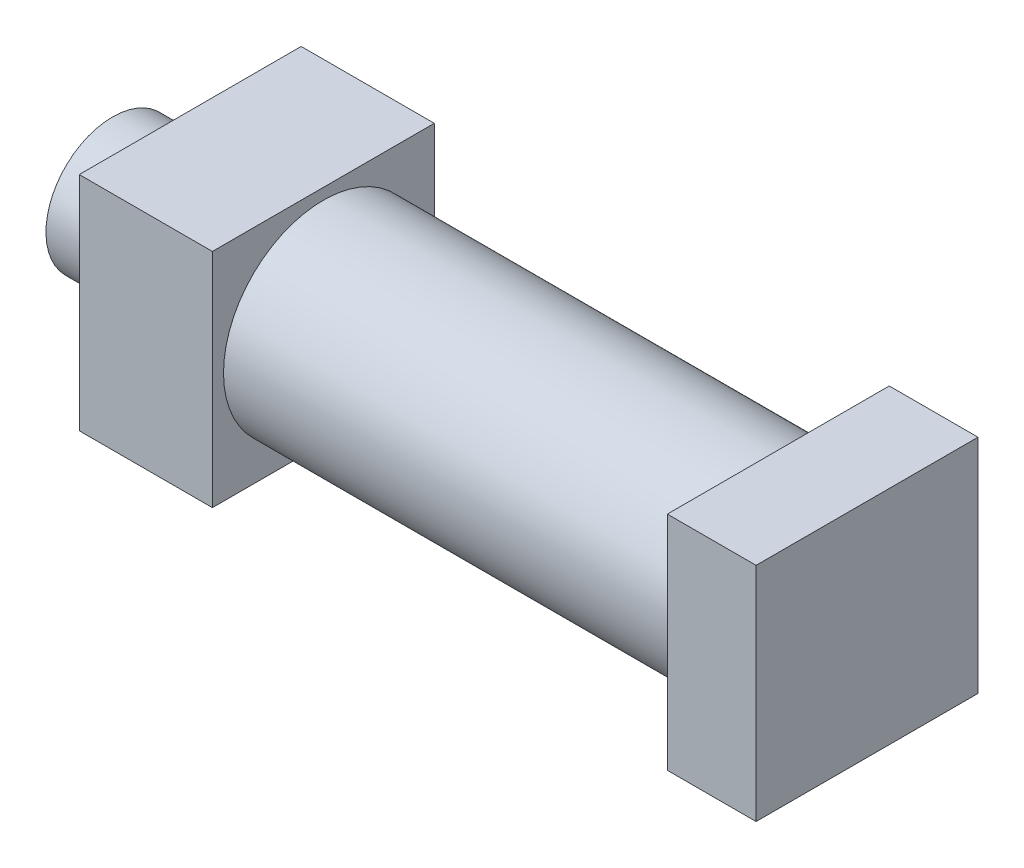
ISO-10303-21;
HEADER;
FILE_DESCRIPTION(('STEP AP214'),'2;1');
FILE_NAME('part.step','',(''),(''),'','','');
FILE_SCHEMA(('AUTOMOTIVE_DESIGN { 1 0 10303 214 1 1 1 1 }'));
ENDSEC;
DATA;
#1=APPLICATION_CONTEXT('core data for automotive mechanical design processes');
#2=APPLICATION_PROTOCOL_DEFINITION('international standard','automotive_design',2000,#1);
#3=PRODUCT_CONTEXT('',#1,'mechanical');
#4=PRODUCT('Part','Part','',(#3));
#5=PRODUCT_RELATED_PRODUCT_CATEGORY('part','',(#4));
#6=PRODUCT_DEFINITION_FORMATION('','',#4);
#7=PRODUCT_DEFINITION_CONTEXT('part definition',#1,'design');
#8=PRODUCT_DEFINITION('design','',#6,#7);
#9=PRODUCT_DEFINITION_SHAPE('','',#8);
#10=(LENGTH_UNIT() NAMED_UNIT(*) SI_UNIT(.MILLI.,.METRE.));
#11=(NAMED_UNIT(*) PLANE_ANGLE_UNIT() SI_UNIT($,.RADIAN.));
#12=(NAMED_UNIT(*) SI_UNIT($,.STERADIAN.) SOLID_ANGLE_UNIT());
#13=UNCERTAINTY_MEASURE_WITH_UNIT(LENGTH_MEASURE(1.E-05),#10,'distance_accuracy_value','');
#14=(GEOMETRIC_REPRESENTATION_CONTEXT(3) GLOBAL_UNCERTAINTY_ASSIGNED_CONTEXT((#13)) GLOBAL_UNIT_ASSIGNED_CONTEXT((#10,
#11,#12)) REPRESENTATION_CONTEXT('',''));
#15=CARTESIAN_POINT('',(0.,0.,0.));
#16=DIRECTION('',(0.,0.,1.));
#17=DIRECTION('',(1.,0.,0.));
#18=AXIS2_PLACEMENT_3D('',#15,#16,#17);
#19=CARTESIAN_POINT('',(-155.575,-31.75,-31.75));
#20=DIRECTION('',(0.,-1.,0.));
#21=DIRECTION('',(1.,0.,0.));
#22=AXIS2_PLACEMENT_3D('',#19,#20,#21);
#23=PLANE('',#22);
#24=DIRECTION('',(0.,0.,1.));
#25=VECTOR('',#24,1.);
#26=CARTESIAN_POINT('',(-193.675,-31.75,-31.75));
#27=LINE('',#26,#25);
#28=CARTESIAN_POINT('',(-193.675,-31.75,-31.75));
#29=VERTEX_POINT('',#28);
#30=CARTESIAN_POINT('',(-193.675,-31.75,31.75));
#31=VERTEX_POINT('',#30);
#32=EDGE_CURVE('E148',#29,#31,#27,.T.);
#33=ORIENTED_EDGE('',*,*,#32,.F.);
#34=DIRECTION('',(-1.,0.,0.));
#35=VECTOR('',#34,1.);
#36=CARTESIAN_POINT('',(-155.575,-31.75,-31.75));
#37=LINE('',#36,#35);
#38=CARTESIAN_POINT('',(-155.575,-31.75,-31.75));
#39=VERTEX_POINT('',#38);
#40=EDGE_CURVE('E136',#39,#29,#37,.T.);
#41=ORIENTED_EDGE('',*,*,#40,.F.);
#42=DIRECTION('',(0.,0.,1.));
#43=VECTOR('',#42,1.);
#44=CARTESIAN_POINT('',(-155.575,-31.75,-31.75));
#45=LINE('',#44,#43);
#46=CARTESIAN_POINT('',(-155.575,-31.75,31.75));
#47=VERTEX_POINT('',#46);
#48=EDGE_CURVE('E130',#39,#47,#45,.T.);
#49=ORIENTED_EDGE('',*,*,#48,.T.);
#50=DIRECTION('',(-1.,0.,0.));
#51=VECTOR('',#50,1.);
#52=CARTESIAN_POINT('',(-155.575,-31.75,31.75));
#53=LINE('',#52,#51);
#54=EDGE_CURVE('E111',#47,#31,#53,.T.);
#55=ORIENTED_EDGE('',*,*,#54,.T.);
#56=EDGE_LOOP('',(#33,#41,#49,#55));
#57=FACE_BOUND('',#56,.T.);
#58=CARTESIAN_POINT('',(-174.625,-31.7499999998176,-11.1125));
#59=DIRECTION('',(0.,-1.,0.));
#60=DIRECTION('',(0.,0.,-1.));
#61=AXIS2_PLACEMENT_3D('',#58,#59,#60);
#62=CIRCLE('',#61,3.96874999999999);
#63=CARTESIAN_POINT('',(-174.625,-31.7499999998176,-15.08125));
#64=VERTEX_POINT('',#63);
#65=EDGE_CURVE('E483',#64,#64,#62,.T.);
#66=ORIENTED_EDGE('',*,*,#65,.F.);
#67=EDGE_LOOP('',(#66));
#68=FACE_BOUND('',#67,.T.);
#69=CARTESIAN_POINT('',(-174.625,-31.7499999998176,11.1125));
#70=DIRECTION('',(0.,1.,0.));
#71=DIRECTION('',(0.,0.,1.));
#72=AXIS2_PLACEMENT_3D('',#69,#70,#71);
#73=CIRCLE('',#72,3.96874999999999);
#74=CARTESIAN_POINT('',(-174.625,-31.7499999998176,7.14375000000002));
#75=VERTEX_POINT('',#74);
#76=EDGE_CURVE('E489',#75,#75,#73,.T.);
#77=ORIENTED_EDGE('',*,*,#76,.T.);
#78=EDGE_LOOP('',(#77));
#79=FACE_BOUND('',#78,.T.);
#80=ADVANCED_FACE('F34',(#57,#68,#79),#23,.T.);
#81=CARTESIAN_POINT('',(-25.4,-31.75,-31.75));
#82=DIRECTION('',(0.,1.,0.));
#83=DIRECTION('',(0.,0.,1.));
#84=AXIS2_PLACEMENT_3D('',#81,#82,#83);
#85=PLANE('',#84);
#86=DIRECTION('',(0.,0.,1.));
#87=VECTOR('',#86,1.);
#88=CARTESIAN_POINT('',(0.,-31.75,-31.75));
#89=LINE('',#88,#87);
#90=CARTESIAN_POINT('',(0.,-31.75,-31.75));
#91=VERTEX_POINT('',#90);
#92=CARTESIAN_POINT('',(0.,-31.75,31.75));
#93=VERTEX_POINT('',#92);
#94=EDGE_CURVE('E178',#91,#93,#89,.T.);
#95=ORIENTED_EDGE('',*,*,#94,.T.);
#96=DIRECTION('',(1.,0.,0.));
#97=VECTOR('',#96,1.);
#98=CARTESIAN_POINT('',(-25.4,-31.75,31.75));
#99=LINE('',#98,#97);
#100=CARTESIAN_POINT('',(-25.4,-31.75,31.75));
#101=VERTEX_POINT('',#100);
#102=EDGE_CURVE('E175',#101,#93,#99,.T.);
#103=ORIENTED_EDGE('',*,*,#102,.F.);
#104=DIRECTION('',(0.,0.,1.));
#105=VECTOR('',#104,1.);
#106=CARTESIAN_POINT('',(-25.4,-31.75,-31.75));
#107=LINE('',#106,#105);
#108=CARTESIAN_POINT('',(-25.4,-31.75,-31.75));
#109=VERTEX_POINT('',#108);
#110=EDGE_CURVE('E82',#109,#101,#107,.T.);
#111=ORIENTED_EDGE('',*,*,#110,.F.);
#112=DIRECTION('',(1.,0.,0.));
#113=VECTOR('',#112,1.);
#114=CARTESIAN_POINT('',(-25.4,-31.75,-31.75));
#115=LINE('',#114,#113);
#116=EDGE_CURVE('E187',#109,#91,#115,.T.);
#117=ORIENTED_EDGE('',*,*,#116,.T.);
#118=EDGE_LOOP('',(#95,#103,#111,#117));
#119=FACE_BOUND('',#118,.T.);
#120=CARTESIAN_POINT('',(-12.7,-31.7499999998176,-11.1125));
#121=DIRECTION('',(0.,-1.,0.));
#122=DIRECTION('',(0.,0.,-1.));
#123=AXIS2_PLACEMENT_3D('',#120,#121,#122);
#124=CIRCLE('',#123,3.96874999999999);
#125=CARTESIAN_POINT('',(-12.7,-31.7499999998176,-15.08125));
#126=VERTEX_POINT('',#125);
#127=EDGE_CURVE('E471',#126,#126,#124,.T.);
#128=ORIENTED_EDGE('',*,*,#127,.F.);
#129=EDGE_LOOP('',(#128));
#130=FACE_BOUND('',#129,.T.);
#131=CARTESIAN_POINT('',(-12.7,-31.7499999998176,11.1125));
#132=DIRECTION('',(0.,1.,0.));
#133=DIRECTION('',(0.,0.,1.));
#134=AXIS2_PLACEMENT_3D('',#131,#132,#133);
#135=CIRCLE('',#134,3.96874999999999);
#136=CARTESIAN_POINT('',(-12.7,-31.7499999998176,7.14375));
#137=VERTEX_POINT('',#136);
#138=EDGE_CURVE('E477',#137,#137,#135,.T.);
#139=ORIENTED_EDGE('',*,*,#138,.T.);
#140=EDGE_LOOP('',(#139));
#141=FACE_BOUND('',#140,.T.);
#142=ADVANCED_FACE('F217',(#119,#130,#141),#85,.F.);
#143=CARTESIAN_POINT('',(-25.4,-31.75,31.75));
#144=DIRECTION('',(-1.,0.,0.));
#145=DIRECTION('',(0.,0.,1.));
#146=AXIS2_PLACEMENT_3D('',#143,#144,#145);
#147=PLANE('',#146);
#148=CARTESIAN_POINT('',(-25.4,0.,0.));
#149=DIRECTION('',(-1.,0.,0.));
#150=DIRECTION('',(0.,0.,1.));
#151=AXIS2_PLACEMENT_3D('',#148,#149,#150);
#152=CIRCLE('',#151,25.4);
#153=CARTESIAN_POINT('',(-25.4,0.,25.4));
#154=VERTEX_POINT('',#153);
#155=EDGE_CURVE('E160',#154,#154,#152,.F.);
#156=ORIENTED_EDGE('',*,*,#155,.F.);
#157=EDGE_LOOP('',(#156));
#158=FACE_BOUND('',#157,.T.);
#159=ADVANCED_FACE('F207',(#158),#147,.T.);
#160=CARTESIAN_POINT('',(-274.497305089622,0.,0.));
#161=DIRECTION('',(1.,0.,0.));
#162=DIRECTION('',(0.,0.,-1.));
#163=AXIS2_PLACEMENT_3D('',#160,#161,#162);
#164=CYLINDRICAL_SURFACE('',#163,25.4);
#165=ORIENTED_EDGE('',*,*,#155,.T.);
#166=EDGE_LOOP('',(#165));
#167=FACE_BOUND('',#166,.T.);
#168=CARTESIAN_POINT('',(-155.575,0.,0.));
#169=DIRECTION('',(-1.,0.,0.));
#170=DIRECTION('',(0.,0.,1.));
#171=AXIS2_PLACEMENT_3D('',#168,#169,#170);
#172=CIRCLE('',#171,25.4);
#173=CARTESIAN_POINT('',(-155.575,0.,25.4));
#174=VERTEX_POINT('',#173);
#175=EDGE_CURVE('E154',#174,#174,#172,.T.);
#176=ORIENTED_EDGE('',*,*,#175,.T.);
#177=EDGE_LOOP('',(#176));
#178=FACE_BOUND('',#177,.T.);
#179=ADVANCED_FACE('F193',(#167,#178),#164,.F.);
#180=CARTESIAN_POINT('',(-155.575,-31.75,31.75));
#181=DIRECTION('',(-1.,0.,0.));
#182=DIRECTION('',(0.,0.,1.));
#183=AXIS2_PLACEMENT_3D('',#180,#181,#182);
#184=PLANE('',#183);
#185=CARTESIAN_POINT('',(-155.575,0.,0.));
#186=DIRECTION('',(-1.,0.,0.));
#187=DIRECTION('',(0.,0.,1.));
#188=AXIS2_PLACEMENT_3D('',#185,#186,#187);
#189=CIRCLE('',#188,12.7);
#190=CARTESIAN_POINT('',(-155.575,0.,12.7));
#191=VERTEX_POINT('',#190);
#192=EDGE_CURVE('E38',#191,#191,#189,.T.);
#193=ORIENTED_EDGE('',*,*,#192,.T.);
#194=EDGE_LOOP('',(#193));
#195=FACE_BOUND('',#194,.T.);
#196=ORIENTED_EDGE('',*,*,#175,.F.);
#197=EDGE_LOOP('',(#196));
#198=FACE_BOUND('',#197,.T.);
#199=ADVANCED_FACE('F195',(#195,#198),#184,.F.);
#200=CARTESIAN_POINT('',(10.5210244842766,0.,0.));
#201=DIRECTION('',(-1.,0.,0.));
#202=DIRECTION('',(0.,-1.,0.));
#203=AXIS2_PLACEMENT_3D('',#200,#201,#202);
#204=CYLINDRICAL_SURFACE('',#203,12.7);
#205=CARTESIAN_POINT('',(-215.9,0.,0.));
#206=DIRECTION('',(-1.,0.,0.));
#207=DIRECTION('',(0.,-1.,0.));
#208=AXIS2_PLACEMENT_3D('',#205,#206,#207);
#209=CIRCLE('',#208,12.7);
#210=CARTESIAN_POINT('',(-215.9,-12.7,0.));
#211=VERTEX_POINT('',#210);
#212=EDGE_CURVE('E465',#211,#211,#209,.T.);
#213=ORIENTED_EDGE('',*,*,#212,.T.);
#214=EDGE_LOOP('',(#213));
#215=FACE_BOUND('',#214,.T.);
#216=ORIENTED_EDGE('',*,*,#192,.F.);
#217=EDGE_LOOP('',(#216));
#218=FACE_BOUND('',#217,.T.);
#219=ADVANCED_FACE('F197',(#215,#218),#204,.F.);
#220=CARTESIAN_POINT('',(-274.497305089622,0.,0.));
#221=DIRECTION('',(1.,0.,0.));
#222=DIRECTION('',(0.,0.,-1.));
#223=AXIS2_PLACEMENT_3D('',#220,#221,#222);
#224=CYLINDRICAL_SURFACE('',#223,28.575);
#225=CARTESIAN_POINT('',(-25.4,0.,0.));
#226=DIRECTION('',(-1.,0.,0.));
#227=DIRECTION('',(0.,0.,1.));
#228=AXIS2_PLACEMENT_3D('',#225,#226,#227);
#229=CIRCLE('',#228,28.575);
#230=CARTESIAN_POINT('',(-25.4,0.,28.575));
#231=VERTEX_POINT('',#230);
#232=EDGE_CURVE('E163',#231,#231,#229,.F.);
#233=ORIENTED_EDGE('',*,*,#232,.F.);
#234=EDGE_LOOP('',(#233));
#235=FACE_BOUND('',#234,.T.);
#236=CARTESIAN_POINT('',(-155.575,0.,0.));
#237=DIRECTION('',(-1.,0.,0.));
#238=DIRECTION('',(0.,0.,1.));
#239=AXIS2_PLACEMENT_3D('',#236,#237,#238);
#240=CIRCLE('',#239,28.575);
#241=CARTESIAN_POINT('',(-155.575,0.,28.575));
#242=VERTEX_POINT('',#241);
#243=EDGE_CURVE('E44',#242,#242,#240,.T.);
#244=ORIENTED_EDGE('',*,*,#243,.F.);
#245=EDGE_LOOP('',(#244));
#246=FACE_BOUND('',#245,.T.);
#247=ADVANCED_FACE('F204',(#235,#246),#224,.T.);
#248=DIRECTION('',(0.,-1.,0.));
#249=VECTOR('',#248,1.);
#250=CARTESIAN_POINT('',(-25.4,31.75,31.75));
#251=LINE('',#250,#249);
#252=CARTESIAN_POINT('',(-25.4,31.75,31.75));
#253=VERTEX_POINT('',#252);
#254=EDGE_CURVE('E167',#253,#101,#251,.T.);
#255=ORIENTED_EDGE('',*,*,#254,.F.);
#256=DIRECTION('',(0.,0.,-1.));
#257=VECTOR('',#256,1.);
#258=CARTESIAN_POINT('',(-25.4,31.75,31.75));
#259=LINE('',#258,#257);
#260=CARTESIAN_POINT('',(-25.4,31.75,-31.75));
#261=VERTEX_POINT('',#260);
#262=EDGE_CURVE('E173',#253,#261,#259,.T.);
#263=ORIENTED_EDGE('',*,*,#262,.T.);
#264=DIRECTION('',(0.,1.,0.));
#265=VECTOR('',#264,1.);
#266=CARTESIAN_POINT('',(-25.4,-31.75,-31.75));
#267=LINE('',#266,#265);
#268=EDGE_CURVE('E171',#109,#261,#267,.T.);
#269=ORIENTED_EDGE('',*,*,#268,.F.);
#270=ORIENTED_EDGE('',*,*,#110,.T.);
#271=EDGE_LOOP('',(#255,#263,#269,#270));
#272=FACE_BOUND('',#271,.T.);
#273=ORIENTED_EDGE('',*,*,#232,.T.);
#274=EDGE_LOOP('',(#273));
#275=FACE_BOUND('',#274,.T.);
#276=ADVANCED_FACE('F228',(#272,#275),#147,.T.);
#277=CARTESIAN_POINT('',(-25.4,31.75,31.75));
#278=DIRECTION('',(0.,0.,1.));
#279=DIRECTION('',(0.,-1.,0.));
#280=AXIS2_PLACEMENT_3D('',#277,#278,#279);
#281=PLANE('',#280);
#282=DIRECTION('',(0.,-1.,0.));
#283=VECTOR('',#282,1.);
#284=CARTESIAN_POINT('',(0.,31.75,31.75));
#285=LINE('',#284,#283);
#286=CARTESIAN_POINT('',(0.,31.75,31.75));
#287=VERTEX_POINT('',#286);
#288=EDGE_CURVE('E166',#287,#93,#285,.T.);
#289=ORIENTED_EDGE('',*,*,#288,.F.);
#290=DIRECTION('',(1.,0.,0.));
#291=VECTOR('',#290,1.);
#292=CARTESIAN_POINT('',(-25.4,31.75,31.75));
#293=LINE('',#292,#291);
#294=EDGE_CURVE('E52',#253,#287,#293,.T.);
#295=ORIENTED_EDGE('',*,*,#294,.F.);
#296=ORIENTED_EDGE('',*,*,#254,.T.);
#297=ORIENTED_EDGE('',*,*,#102,.T.);
#298=EDGE_LOOP('',(#289,#295,#296,#297));
#299=FACE_BOUND('',#298,.T.);
#300=ADVANCED_FACE('F36',(#299),#281,.T.);
#301=CARTESIAN_POINT('',(-25.4,31.75,31.75));
#302=DIRECTION('',(0.,-1.,0.));
#303=DIRECTION('',(0.,0.,-1.));
#304=AXIS2_PLACEMENT_3D('',#301,#302,#303);
#305=PLANE('',#304);
#306=DIRECTION('',(0.,0.,-1.));
#307=VECTOR('',#306,1.);
#308=CARTESIAN_POINT('',(0.,31.75,31.75));
#309=LINE('',#308,#307);
#310=CARTESIAN_POINT('',(0.,31.75,-31.75));
#311=VERTEX_POINT('',#310);
#312=EDGE_CURVE('E169',#287,#311,#309,.T.);
#313=ORIENTED_EDGE('',*,*,#312,.T.);
#314=DIRECTION('',(1.,0.,0.));
#315=VECTOR('',#314,1.);
#316=CARTESIAN_POINT('',(-25.4,31.75,-31.75));
#317=LINE('',#316,#315);
#318=EDGE_CURVE('E71',#261,#311,#317,.T.);
#319=ORIENTED_EDGE('',*,*,#318,.F.);
#320=ORIENTED_EDGE('',*,*,#262,.F.);
#321=ORIENTED_EDGE('',*,*,#294,.T.);
#322=EDGE_LOOP('',(#313,#319,#320,#321));
#323=FACE_BOUND('',#322,.T.);
#324=ADVANCED_FACE('F242',(#323),#305,.F.);
#325=CARTESIAN_POINT('',(-25.4,-31.75,-31.75));
#326=DIRECTION('',(0.,0.,-1.));
#327=DIRECTION('',(0.,1.,0.));
#328=AXIS2_PLACEMENT_3D('',#325,#326,#327);
#329=PLANE('',#328);
#330=DIRECTION('',(0.,1.,0.));
#331=VECTOR('',#330,1.);
#332=CARTESIAN_POINT('',(0.,-31.75,-31.75));
#333=LINE('',#332,#331);
#334=EDGE_CURVE('E181',#91,#311,#333,.T.);
#335=ORIENTED_EDGE('',*,*,#334,.F.);
#336=ORIENTED_EDGE('',*,*,#116,.F.);
#337=ORIENTED_EDGE('',*,*,#268,.T.);
#338=ORIENTED_EDGE('',*,*,#318,.T.);
#339=EDGE_LOOP('',(#335,#336,#337,#338));
#340=FACE_BOUND('',#339,.T.);
#341=ADVANCED_FACE('F240',(#340),#329,.T.);
#342=CARTESIAN_POINT('',(0.,-31.75,31.75));
#343=DIRECTION('',(-1.,0.,0.));
#344=DIRECTION('',(0.,0.,1.));
#345=AXIS2_PLACEMENT_3D('',#342,#343,#344);
#346=PLANE('',#345);
#347=ORIENTED_EDGE('',*,*,#288,.T.);
#348=ORIENTED_EDGE('',*,*,#94,.F.);
#349=ORIENTED_EDGE('',*,*,#334,.T.);
#350=ORIENTED_EDGE('',*,*,#312,.F.);
#351=EDGE_LOOP('',(#347,#348,#349,#350));
#352=FACE_BOUND('',#351,.T.);
#353=ADVANCED_FACE('F215',(#352),#346,.F.);
#354=ORIENTED_EDGE('',*,*,#48,.F.);
#355=DIRECTION('',(0.,-1.,0.));
#356=VECTOR('',#355,1.);
#357=CARTESIAN_POINT('',(-155.575,31.75,-31.75));
#358=LINE('',#357,#356);
#359=CARTESIAN_POINT('',(-155.575,31.75,-31.75));
#360=VERTEX_POINT('',#359);
#361=EDGE_CURVE('E122',#360,#39,#358,.T.);
#362=ORIENTED_EDGE('',*,*,#361,.F.);
#363=DIRECTION('',(0.,0.,-1.));
#364=VECTOR('',#363,1.);
#365=CARTESIAN_POINT('',(-155.575,31.75,31.75));
#366=LINE('',#365,#364);
#367=CARTESIAN_POINT('',(-155.575,31.75,31.75));
#368=VERTEX_POINT('',#367);
#369=EDGE_CURVE('E133',#368,#360,#366,.T.);
#370=ORIENTED_EDGE('',*,*,#369,.F.);
#371=DIRECTION('',(0.,1.,0.));
#372=VECTOR('',#371,1.);
#373=CARTESIAN_POINT('',(-155.575,-31.75,31.75));
#374=LINE('',#373,#372);
#375=EDGE_CURVE('E114',#47,#368,#374,.T.);
#376=ORIENTED_EDGE('',*,*,#375,.F.);
#377=EDGE_LOOP('',(#354,#362,#370,#376));
#378=FACE_BOUND('',#377,.T.);
#379=ORIENTED_EDGE('',*,*,#243,.T.);
#380=EDGE_LOOP('',(#379));
#381=FACE_BOUND('',#380,.T.);
#382=ADVANCED_FACE('F127',(#378,#381),#184,.F.);
#383=CARTESIAN_POINT('',(-155.575,31.75,-31.75));
#384=DIRECTION('',(0.,0.,-1.));
#385=DIRECTION('',(0.,1.,0.));
#386=AXIS2_PLACEMENT_3D('',#383,#384,#385);
#387=PLANE('',#386);
#388=DIRECTION('',(0.,-1.,0.));
#389=VECTOR('',#388,1.);
#390=CARTESIAN_POINT('',(-193.675,31.75,-31.75));
#391=LINE('',#390,#389);
#392=CARTESIAN_POINT('',(-193.675,31.75,-31.75));
#393=VERTEX_POINT('',#392);
#394=EDGE_CURVE('E137',#393,#29,#391,.T.);
#395=ORIENTED_EDGE('',*,*,#394,.F.);
#396=DIRECTION('',(-1.,0.,0.));
#397=VECTOR('',#396,1.);
#398=CARTESIAN_POINT('',(-155.575,31.75,-31.75));
#399=LINE('',#398,#397);
#400=EDGE_CURVE('E155',#360,#393,#399,.T.);
#401=ORIENTED_EDGE('',*,*,#400,.F.);
#402=ORIENTED_EDGE('',*,*,#361,.T.);
#403=ORIENTED_EDGE('',*,*,#40,.T.);
#404=EDGE_LOOP('',(#395,#401,#402,#403));
#405=FACE_BOUND('',#404,.T.);
#406=ADVANCED_FACE('F214',(#405),#387,.T.);
#407=CARTESIAN_POINT('',(-155.575,31.75,31.75));
#408=DIRECTION('',(0.,1.,0.));
#409=DIRECTION('',(-1.,0.,0.));
#410=AXIS2_PLACEMENT_3D('',#407,#408,#409);
#411=PLANE('',#410);
#412=DIRECTION('',(0.,0.,-1.));
#413=VECTOR('',#412,1.);
#414=CARTESIAN_POINT('',(-193.675,31.75,31.75));
#415=LINE('',#414,#413);
#416=CARTESIAN_POINT('',(-193.675,31.75,31.75));
#417=VERTEX_POINT('',#416);
#418=EDGE_CURVE('E140',#417,#393,#415,.T.);
#419=ORIENTED_EDGE('',*,*,#418,.F.);
#420=DIRECTION('',(-1.,0.,0.));
#421=VECTOR('',#420,1.);
#422=CARTESIAN_POINT('',(-155.575,31.75,31.75));
#423=LINE('',#422,#421);
#424=EDGE_CURVE('E121',#368,#417,#423,.T.);
#425=ORIENTED_EDGE('',*,*,#424,.F.);
#426=ORIENTED_EDGE('',*,*,#369,.T.);
#427=ORIENTED_EDGE('',*,*,#400,.T.);
#428=EDGE_LOOP('',(#419,#425,#426,#427));
#429=FACE_BOUND('',#428,.T.);
#430=ADVANCED_FACE('F389',(#429),#411,.T.);
#431=CARTESIAN_POINT('',(-155.575,-31.75,31.75));
#432=DIRECTION('',(0.,0.,1.));
#433=DIRECTION('',(0.,-1.,0.));
#434=AXIS2_PLACEMENT_3D('',#431,#432,#433);
#435=PLANE('',#434);
#436=DIRECTION('',(0.,1.,0.));
#437=VECTOR('',#436,1.);
#438=CARTESIAN_POINT('',(-193.675,-31.75,31.75));
#439=LINE('',#438,#437);
#440=EDGE_CURVE('E116',#31,#417,#439,.T.);
#441=ORIENTED_EDGE('',*,*,#440,.F.);
#442=ORIENTED_EDGE('',*,*,#54,.F.);
#443=ORIENTED_EDGE('',*,*,#375,.T.);
#444=ORIENTED_EDGE('',*,*,#424,.T.);
#445=EDGE_LOOP('',(#441,#442,#443,#444));
#446=FACE_BOUND('',#445,.T.);
#447=ADVANCED_FACE('F113',(#446),#435,.T.);
#448=CARTESIAN_POINT('',(-193.675,0.,0.));
#449=DIRECTION('',(-1.,0.,0.));
#450=DIRECTION('',(0.,-1.,0.));
#451=AXIS2_PLACEMENT_3D('',#448,#449,#450);
#452=PLANE('',#451);
#453=CARTESIAN_POINT('',(-193.675,0.,0.));
#454=DIRECTION('',(-1.,0.,0.));
#455=DIRECTION('',(0.,-1.,0.));
#456=AXIS2_PLACEMENT_3D('',#453,#454,#455);
#457=CIRCLE('',#456,19.05);
#458=CARTESIAN_POINT('',(-193.675,-19.05,0.));
#459=VERTEX_POINT('',#458);
#460=EDGE_CURVE('E11',#459,#459,#457,.T.);
#461=ORIENTED_EDGE('',*,*,#460,.F.);
#462=EDGE_LOOP('',(#461));
#463=FACE_BOUND('',#462,.T.);
#464=ORIENTED_EDGE('',*,*,#32,.T.);
#465=ORIENTED_EDGE('',*,*,#440,.T.);
#466=ORIENTED_EDGE('',*,*,#418,.T.);
#467=ORIENTED_EDGE('',*,*,#394,.T.);
#468=EDGE_LOOP('',(#464,#465,#466,#467));
#469=FACE_BOUND('',#468,.T.);
#470=ADVANCED_FACE('F230',(#463,#469),#452,.T.);
#471=CARTESIAN_POINT('',(-215.9,0.,0.));
#472=DIRECTION('',(1.,0.,0.));
#473=DIRECTION('',(0.,1.,0.));
#474=AXIS2_PLACEMENT_3D('',#471,#472,#473);
#475=CYLINDRICAL_SURFACE('',#474,19.05);
#476=CARTESIAN_POINT('',(-215.9,0.,0.));
#477=DIRECTION('',(1.,0.,0.));
#478=DIRECTION('',(0.,1.,0.));
#479=AXIS2_PLACEMENT_3D('',#476,#477,#478);
#480=CIRCLE('',#479,19.05);
#481=CARTESIAN_POINT('',(-215.9,19.05,0.));
#482=VERTEX_POINT('',#481);
#483=EDGE_CURVE('E143',#482,#482,#480,.T.);
#484=ORIENTED_EDGE('',*,*,#483,.T.);
#485=EDGE_LOOP('',(#484));
#486=FACE_BOUND('',#485,.T.);
#487=ORIENTED_EDGE('',*,*,#460,.T.);
#488=EDGE_LOOP('',(#487));
#489=FACE_BOUND('',#488,.T.);
#490=ADVANCED_FACE('F233',(#486,#489),#475,.T.);
#491=CARTESIAN_POINT('',(-215.9,0.,0.));
#492=DIRECTION('',(1.,0.,0.));
#493=DIRECTION('',(0.,1.,0.));
#494=AXIS2_PLACEMENT_3D('',#491,#492,#493);
#495=PLANE('',#494);
#496=ORIENTED_EDGE('',*,*,#212,.F.);
#497=EDGE_LOOP('',(#496));
#498=FACE_BOUND('',#497,.T.);
#499=ORIENTED_EDGE('',*,*,#483,.F.);
#500=EDGE_LOOP('',(#499));
#501=FACE_BOUND('',#500,.T.);
#502=ADVANCED_FACE('F277',(#498,#501),#495,.F.);
#503=CARTESIAN_POINT('',(-12.7,-12.6999999998176,-11.1125));
#504=DIRECTION('',(0.,-1.,0.));
#505=DIRECTION('',(0.,0.,-1.));
#506=AXIS2_PLACEMENT_3D('',#503,#504,#505);
#507=CYLINDRICAL_SURFACE('',#506,3.96874999999999);
#508=CARTESIAN_POINT('',(-12.7,-12.6999999998176,-11.1125));
#509=DIRECTION('',(0.,-1.,0.));
#510=DIRECTION('',(0.,0.,-1.));
#511=AXIS2_PLACEMENT_3D('',#508,#509,#510);
#512=CIRCLE('',#511,3.96874999999999);
#513=CARTESIAN_POINT('',(-12.7,-12.6999999998176,-15.08125));
#514=VERTEX_POINT('',#513);
#515=EDGE_CURVE('E468',#514,#514,#512,.T.);
#516=CARTESIAN_POINT('',(-12.7,-12.6999999998176,-15.08125));
#517=CARTESIAN_POINT('',(-12.7,-12.8984374998176,-15.08125));
#518=CARTESIAN_POINT('',(-12.7,-13.0968749998176,-15.08125));
#519=CARTESIAN_POINT('',(-12.7,-13.4937499998176,-15.08125));
#520=CARTESIAN_POINT('',(-12.7,-13.6921874998176,-15.08125));
#521=CARTESIAN_POINT('',(-12.7,-14.0890624998176,-15.08125));
#522=CARTESIAN_POINT('',(-12.7,-14.2874999998176,-15.08125));
#523=CARTESIAN_POINT('',(-12.7,-14.6843749998176,-15.08125));
#524=CARTESIAN_POINT('',(-12.7,-14.8828124998176,-15.08125));
#525=CARTESIAN_POINT('',(-12.7,-15.2796874998176,-15.08125));
#526=CARTESIAN_POINT('',(-12.7,-15.4781249998176,-15.08125));
#527=CARTESIAN_POINT('',(-12.7,-15.8749999998176,-15.08125));
#528=CARTESIAN_POINT('',(-12.7,-16.0734374998176,-15.08125));
#529=CARTESIAN_POINT('',(-12.7,-16.4703124998176,-15.08125));
#530=CARTESIAN_POINT('',(-12.7,-16.6687499998176,-15.08125));
#531=CARTESIAN_POINT('',(-12.7,-17.0656249998176,-15.08125));
#532=CARTESIAN_POINT('',(-12.7,-17.2640624998176,-15.08125));
#533=CARTESIAN_POINT('',(-12.7,-17.6609374998176,-15.08125));
#534=CARTESIAN_POINT('',(-12.7,-17.8593749998176,-15.08125));
#535=CARTESIAN_POINT('',(-12.7,-18.2562499998176,-15.08125));
#536=CARTESIAN_POINT('',(-12.7,-18.4546874998176,-15.08125));
#537=CARTESIAN_POINT('',(-12.7,-18.8515624998176,-15.08125));
#538=CARTESIAN_POINT('',(-12.7,-19.0499999998176,-15.08125));
#539=CARTESIAN_POINT('',(-12.7,-19.4468749998176,-15.08125));
#540=CARTESIAN_POINT('',(-12.7,-19.6453124998176,-15.08125));
#541=CARTESIAN_POINT('',(-12.7,-20.0421874998176,-15.08125));
#542=CARTESIAN_POINT('',(-12.7,-20.2406249998176,-15.08125));
#543=CARTESIAN_POINT('',(-12.7,-20.6374999998176,-15.08125));
#544=CARTESIAN_POINT('',(-12.7,-20.8359374998176,-15.08125));
#545=CARTESIAN_POINT('',(-12.7,-21.2328124998176,-15.08125));
#546=CARTESIAN_POINT('',(-12.7,-21.4312499998176,-15.08125));
#547=CARTESIAN_POINT('',(-12.7,-21.8281249998176,-15.08125));
#548=CARTESIAN_POINT('',(-12.7,-22.0265624998176,-15.08125));
#549=CARTESIAN_POINT('',(-12.7,-22.4234374998176,-15.08125));
#550=CARTESIAN_POINT('',(-12.7,-22.6218749998176,-15.08125));
#551=CARTESIAN_POINT('',(-12.7,-23.0187499998176,-15.08125));
#552=CARTESIAN_POINT('',(-12.7,-23.2171874998176,-15.08125));
#553=CARTESIAN_POINT('',(-12.7,-23.6140624998176,-15.08125));
#554=CARTESIAN_POINT('',(-12.7,-23.8124999998176,-15.08125));
#555=CARTESIAN_POINT('',(-12.7,-24.2093749998176,-15.08125));
#556=CARTESIAN_POINT('',(-12.7,-24.4078124998176,-15.08125));
#557=CARTESIAN_POINT('',(-12.7,-24.8046874998176,-15.08125));
#558=CARTESIAN_POINT('',(-12.7,-25.0031249998176,-15.08125));
#559=CARTESIAN_POINT('',(-12.7,-25.3999999998176,-15.08125));
#560=CARTESIAN_POINT('',(-12.7,-25.5984374998176,-15.08125));
#561=CARTESIAN_POINT('',(-12.7,-25.9953124998176,-15.08125));
#562=CARTESIAN_POINT('',(-12.7,-26.1937499998176,-15.08125));
#563=CARTESIAN_POINT('',(-12.7,-26.5906249998176,-15.08125));
#564=CARTESIAN_POINT('',(-12.7,-26.7890624998176,-15.08125));
#565=CARTESIAN_POINT('',(-12.7,-27.1859374998176,-15.08125));
#566=CARTESIAN_POINT('',(-12.7,-27.3843749998176,-15.08125));
#567=CARTESIAN_POINT('',(-12.7,-27.7812499998176,-15.08125));
#568=CARTESIAN_POINT('',(-12.7,-27.9796874998176,-15.08125));
#569=CARTESIAN_POINT('',(-12.7,-28.3765624998176,-15.08125));
#570=CARTESIAN_POINT('',(-12.7,-28.5749999998176,-15.08125));
#571=CARTESIAN_POINT('',(-12.7,-28.9718749998176,-15.08125));
#572=CARTESIAN_POINT('',(-12.7,-29.1703124998176,-15.08125));
#573=CARTESIAN_POINT('',(-12.7,-29.5671874998176,-15.08125));
#574=CARTESIAN_POINT('',(-12.7,-29.7656249998176,-15.08125));
#575=CARTESIAN_POINT('',(-12.7,-30.1624999998176,-15.08125));
#576=CARTESIAN_POINT('',(-12.7,-30.3609374998176,-15.08125));
#577=CARTESIAN_POINT('',(-12.7,-30.7578124998176,-15.08125));
#578=CARTESIAN_POINT('',(-12.7,-30.9562499998176,-15.08125));
#579=CARTESIAN_POINT('',(-12.7,-31.3531249998176,-15.08125));
#580=CARTESIAN_POINT('',(-12.7,-31.5515624998176,-15.08125));
#581=CARTESIAN_POINT('',(-12.7,-31.7499999998176,-15.08125));
#582=B_SPLINE_CURVE_WITH_KNOTS('',3,(#516,#517,#518,#519,#520,#521,#522,#523,#524,#525,#526,
#527,#528,#529,#530,#531,#532,#533,#534,#535,#536,#537,#538,#539,#540,#541,#542,#543,#544,#545,
#546,#547,#548,#549,#550,#551,#552,#553,#554,#555,#556,#557,#558,#559,#560,#561,#562,#563,#564,
#565,#566,#567,#568,#569,#570,#571,#572,#573,#574,#575,#576,#577,#578,#579,#580,#581),
.UNSPECIFIED.,.F.,.F.,(4,2,2,2,2,2,2,2,2,2,2,2,2,2,2,2,2,2,2,2,2,2,2,2,2,2,2,2,2,2,2,2,4),(0.,
0.5953125,1.190625,1.7859375,2.38125,2.9765625,3.571875,4.1671875,4.7625,5.3578125,5.953125,
6.5484375,7.14375,7.7390625,8.334375,8.9296875,9.525,10.1203125,10.715625,11.3109375,11.90625,
12.5015625,13.096875,13.6921875,14.2875,14.8828125,15.478125,16.0734375,16.66875,17.2640625,
17.859375,18.4546875,19.05),.UNSPECIFIED.);
#583=EDGE_CURVE('BSEAM280',#514,#126,#582,.T.);
#584=ORIENTED_EDGE('',*,*,#515,.F.);
#585=ORIENTED_EDGE('',*,*,#127,.T.);
#586=ORIENTED_EDGE('',*,*,#583,.T.);
#587=ORIENTED_EDGE('',*,*,#583,.F.);
#588=EDGE_LOOP('',(#584,#586,#585,#587));
#589=FACE_BOUND('',#588,.T.);
#590=ADVANCED_FACE('F280',(#589),#507,.F.);
#591=CARTESIAN_POINT('',(-12.7,-12.6999999998176,-11.1125));
#592=DIRECTION('',(0.,-1.,0.));
#593=DIRECTION('',(0.,0.,-1.));
#594=AXIS2_PLACEMENT_3D('',#591,#592,#593);
#595=PLANE('',#594);
#596=ORIENTED_EDGE('',*,*,#515,.T.);
#597=EDGE_LOOP('',(#596));
#598=FACE_BOUND('',#597,.T.);
#599=ADVANCED_FACE('F302',(#598),#595,.T.);
#600=CARTESIAN_POINT('',(-12.7,-12.6999999998176,11.1125));
#601=DIRECTION('',(0.,-1.,0.));
#602=DIRECTION('',(0.,0.,-1.));
#603=AXIS2_PLACEMENT_3D('',#600,#601,#602);
#604=CYLINDRICAL_SURFACE('',#603,3.96874999999999);
#605=CARTESIAN_POINT('',(-12.7,-12.6999999998176,11.1125));
#606=DIRECTION('',(0.,1.,0.));
#607=DIRECTION('',(0.,0.,1.));
#608=AXIS2_PLACEMENT_3D('',#605,#606,#607);
#609=CIRCLE('',#608,3.96874999999999);
#610=CARTESIAN_POINT('',(-12.7,-12.6999999998176,7.14375));
#611=VERTEX_POINT('',#610);
#612=EDGE_CURVE('E475',#611,#611,#609,.T.);
#613=CARTESIAN_POINT('',(-12.7,-12.6999999998176,7.14375));
#614=CARTESIAN_POINT('',(-12.7,-12.8984374998176,7.14375));
#615=CARTESIAN_POINT('',(-12.7,-13.0968749998176,7.14375));
#616=CARTESIAN_POINT('',(-12.7,-13.4937499998176,7.14375));
#617=CARTESIAN_POINT('',(-12.7,-13.6921874998176,7.14375));
#618=CARTESIAN_POINT('',(-12.7,-14.0890624998176,7.14375));
#619=CARTESIAN_POINT('',(-12.7,-14.2874999998176,7.14375));
#620=CARTESIAN_POINT('',(-12.7,-14.6843749998176,7.14375));
#621=CARTESIAN_POINT('',(-12.7,-14.8828124998176,7.14375));
#622=CARTESIAN_POINT('',(-12.7,-15.2796874998176,7.14375));
#623=CARTESIAN_POINT('',(-12.7,-15.4781249998176,7.14375));
#624=CARTESIAN_POINT('',(-12.7,-15.8749999998176,7.14375));
#625=CARTESIAN_POINT('',(-12.7,-16.0734374998176,7.14375));
#626=CARTESIAN_POINT('',(-12.7,-16.4703124998176,7.14375));
#627=CARTESIAN_POINT('',(-12.7,-16.6687499998176,7.14375));
#628=CARTESIAN_POINT('',(-12.7,-17.0656249998176,7.14375));
#629=CARTESIAN_POINT('',(-12.7,-17.2640624998176,7.14375));
#630=CARTESIAN_POINT('',(-12.7,-17.6609374998176,7.14375));
#631=CARTESIAN_POINT('',(-12.7,-17.8593749998176,7.14375));
#632=CARTESIAN_POINT('',(-12.7,-18.2562499998176,7.14375));
#633=CARTESIAN_POINT('',(-12.7,-18.4546874998176,7.14375));
#634=CARTESIAN_POINT('',(-12.7,-18.8515624998176,7.14375));
#635=CARTESIAN_POINT('',(-12.7,-19.0499999998176,7.14375));
#636=CARTESIAN_POINT('',(-12.7,-19.4468749998176,7.14375));
#637=CARTESIAN_POINT('',(-12.7,-19.6453124998176,7.14375));
#638=CARTESIAN_POINT('',(-12.7,-20.0421874998176,7.14375));
#639=CARTESIAN_POINT('',(-12.7,-20.2406249998176,7.14375));
#640=CARTESIAN_POINT('',(-12.7,-20.6374999998176,7.14375));
#641=CARTESIAN_POINT('',(-12.7,-20.8359374998176,7.14375));
#642=CARTESIAN_POINT('',(-12.7,-21.2328124998176,7.14375));
#643=CARTESIAN_POINT('',(-12.7,-21.4312499998176,7.14375));
#644=CARTESIAN_POINT('',(-12.7,-21.8281249998176,7.14375));
#645=CARTESIAN_POINT('',(-12.7,-22.0265624998176,7.14375));
#646=CARTESIAN_POINT('',(-12.7,-22.4234374998176,7.14375));
#647=CARTESIAN_POINT('',(-12.7,-22.6218749998176,7.14375));
#648=CARTESIAN_POINT('',(-12.7,-23.0187499998176,7.14375));
#649=CARTESIAN_POINT('',(-12.7,-23.2171874998176,7.14375));
#650=CARTESIAN_POINT('',(-12.7,-23.6140624998176,7.14375));
#651=CARTESIAN_POINT('',(-12.7,-23.8124999998176,7.14375));
#652=CARTESIAN_POINT('',(-12.7,-24.2093749998176,7.14375));
#653=CARTESIAN_POINT('',(-12.7,-24.4078124998176,7.14375));
#654=CARTESIAN_POINT('',(-12.7,-24.8046874998176,7.14375));
#655=CARTESIAN_POINT('',(-12.7,-25.0031249998176,7.14375));
#656=CARTESIAN_POINT('',(-12.7,-25.3999999998176,7.14375));
#657=CARTESIAN_POINT('',(-12.7,-25.5984374998176,7.14375));
#658=CARTESIAN_POINT('',(-12.7,-25.9953124998176,7.14375));
#659=CARTESIAN_POINT('',(-12.7,-26.1937499998176,7.14375));
#660=CARTESIAN_POINT('',(-12.7,-26.5906249998176,7.14375));
#661=CARTESIAN_POINT('',(-12.7,-26.7890624998176,7.14375));
#662=CARTESIAN_POINT('',(-12.7,-27.1859374998176,7.14375));
#663=CARTESIAN_POINT('',(-12.7,-27.3843749998176,7.14375));
#664=CARTESIAN_POINT('',(-12.7,-27.7812499998176,7.14375));
#665=CARTESIAN_POINT('',(-12.7,-27.9796874998176,7.14375));
#666=CARTESIAN_POINT('',(-12.7,-28.3765624998176,7.14375));
#667=CARTESIAN_POINT('',(-12.7,-28.5749999998176,7.14375));
#668=CARTESIAN_POINT('',(-12.7,-28.9718749998176,7.14375));
#669=CARTESIAN_POINT('',(-12.7,-29.1703124998176,7.14375));
#670=CARTESIAN_POINT('',(-12.7,-29.5671874998176,7.14375));
#671=CARTESIAN_POINT('',(-12.7,-29.7656249998176,7.14375));
#672=CARTESIAN_POINT('',(-12.7,-30.1624999998176,7.14375));
#673=CARTESIAN_POINT('',(-12.7,-30.3609374998176,7.14375));
#674=CARTESIAN_POINT('',(-12.7,-30.7578124998176,7.14375));
#675=CARTESIAN_POINT('',(-12.7,-30.9562499998176,7.14375));
#676=CARTESIAN_POINT('',(-12.7,-31.3531249998176,7.14375));
#677=CARTESIAN_POINT('',(-12.7,-31.5515624998176,7.14375));
#678=CARTESIAN_POINT('',(-12.7,-31.7499999998176,7.14375));
#679=B_SPLINE_CURVE_WITH_KNOTS('',3,(#613,#614,#615,#616,#617,#618,#619,#620,#621,#622,#623,
#624,#625,#626,#627,#628,#629,#630,#631,#632,#633,#634,#635,#636,#637,#638,#639,#640,#641,#642,
#643,#644,#645,#646,#647,#648,#649,#650,#651,#652,#653,#654,#655,#656,#657,#658,#659,#660,#661,
#662,#663,#664,#665,#666,#667,#668,#669,#670,#671,#672,#673,#674,#675,#676,#677,#678),
.UNSPECIFIED.,.F.,.F.,(4,2,2,2,2,2,2,2,2,2,2,2,2,2,2,2,2,2,2,2,2,2,2,2,2,2,2,2,2,2,2,2,4),(0.,
0.5953125,1.190625,1.7859375,2.38125,2.9765625,3.571875,4.1671875,4.7625,5.3578125,5.953125,
6.5484375,7.14375,7.7390625,8.334375,8.9296875,9.525,10.1203125,10.715625,11.3109375,11.90625,
12.5015625,13.096875,13.6921875,14.2875,14.8828125,15.478125,16.0734375,16.66875,17.2640625,
17.859375,18.4546875,19.05),.UNSPECIFIED.);
#680=EDGE_CURVE('BSEAM312',#611,#137,#679,.T.);
#681=ORIENTED_EDGE('',*,*,#612,.T.);
#682=ORIENTED_EDGE('',*,*,#138,.F.);
#683=ORIENTED_EDGE('',*,*,#680,.T.);
#684=ORIENTED_EDGE('',*,*,#680,.F.);
#685=EDGE_LOOP('',(#681,#683,#682,#684));
#686=FACE_BOUND('',#685,.T.);
#687=ADVANCED_FACE('F312',(#686),#604,.F.);
#688=CARTESIAN_POINT('',(-12.7,-12.6999999998176,11.1125));
#689=DIRECTION('',(0.,1.,0.));
#690=DIRECTION('',(0.,0.,1.));
#691=AXIS2_PLACEMENT_3D('',#688,#689,#690);
#692=PLANE('',#691);
#693=ORIENTED_EDGE('',*,*,#612,.F.);
#694=EDGE_LOOP('',(#693));
#695=FACE_BOUND('',#694,.T.);
#696=ADVANCED_FACE('F322',(#695),#692,.F.);
#697=CARTESIAN_POINT('',(-174.625,-12.6999999998176,-11.1125));
#698=DIRECTION('',(0.,-1.,0.));
#699=DIRECTION('',(0.,0.,-1.));
#700=AXIS2_PLACEMENT_3D('',#697,#698,#699);
#701=CYLINDRICAL_SURFACE('',#700,3.96874999999999);
#702=CARTESIAN_POINT('',(-174.625,-12.6999999998176,-11.1125));
#703=DIRECTION('',(0.,-1.,0.));
#704=DIRECTION('',(0.,0.,-1.));
#705=AXIS2_PLACEMENT_3D('',#702,#703,#704);
#706=CIRCLE('',#705,3.96874999999999);
#707=CARTESIAN_POINT('',(-174.625,-12.6999999998176,-15.08125));
#708=VERTEX_POINT('',#707);
#709=EDGE_CURVE('E480',#708,#708,#706,.T.);
#710=CARTESIAN_POINT('',(-174.625,-12.6999999998176,-15.08125));
#711=CARTESIAN_POINT('',(-174.625,-12.8984374998176,-15.08125));
#712=CARTESIAN_POINT('',(-174.625,-13.0968749998176,-15.08125));
#713=CARTESIAN_POINT('',(-174.625,-13.4937499998176,-15.08125));
#714=CARTESIAN_POINT('',(-174.625,-13.6921874998176,-15.08125));
#715=CARTESIAN_POINT('',(-174.625,-14.0890624998176,-15.08125));
#716=CARTESIAN_POINT('',(-174.625,-14.2874999998176,-15.08125));
#717=CARTESIAN_POINT('',(-174.625,-14.6843749998176,-15.08125));
#718=CARTESIAN_POINT('',(-174.625,-14.8828124998176,-15.08125));
#719=CARTESIAN_POINT('',(-174.625,-15.2796874998176,-15.08125));
#720=CARTESIAN_POINT('',(-174.625,-15.4781249998176,-15.08125));
#721=CARTESIAN_POINT('',(-174.625,-15.8749999998176,-15.08125));
#722=CARTESIAN_POINT('',(-174.625,-16.0734374998176,-15.08125));
#723=CARTESIAN_POINT('',(-174.625,-16.4703124998176,-15.08125));
#724=CARTESIAN_POINT('',(-174.625,-16.6687499998176,-15.08125));
#725=CARTESIAN_POINT('',(-174.625,-17.0656249998176,-15.08125));
#726=CARTESIAN_POINT('',(-174.625,-17.2640624998176,-15.08125));
#727=CARTESIAN_POINT('',(-174.625,-17.6609374998176,-15.08125));
#728=CARTESIAN_POINT('',(-174.625,-17.8593749998176,-15.08125));
#729=CARTESIAN_POINT('',(-174.625,-18.2562499998176,-15.08125));
#730=CARTESIAN_POINT('',(-174.625,-18.4546874998176,-15.08125));
#731=CARTESIAN_POINT('',(-174.625,-18.8515624998176,-15.08125));
#732=CARTESIAN_POINT('',(-174.625,-19.0499999998176,-15.08125));
#733=CARTESIAN_POINT('',(-174.625,-19.4468749998176,-15.08125));
#734=CARTESIAN_POINT('',(-174.625,-19.6453124998176,-15.08125));
#735=CARTESIAN_POINT('',(-174.625,-20.0421874998176,-15.08125));
#736=CARTESIAN_POINT('',(-174.625,-20.2406249998176,-15.08125));
#737=CARTESIAN_POINT('',(-174.625,-20.6374999998176,-15.08125));
#738=CARTESIAN_POINT('',(-174.625,-20.8359374998176,-15.08125));
#739=CARTESIAN_POINT('',(-174.625,-21.2328124998176,-15.08125));
#740=CARTESIAN_POINT('',(-174.625,-21.4312499998176,-15.08125));
#741=CARTESIAN_POINT('',(-174.625,-21.8281249998176,-15.08125));
#742=CARTESIAN_POINT('',(-174.625,-22.0265624998176,-15.08125));
#743=CARTESIAN_POINT('',(-174.625,-22.4234374998176,-15.08125));
#744=CARTESIAN_POINT('',(-174.625,-22.6218749998176,-15.08125));
#745=CARTESIAN_POINT('',(-174.625,-23.0187499998176,-15.08125));
#746=CARTESIAN_POINT('',(-174.625,-23.2171874998176,-15.08125));
#747=CARTESIAN_POINT('',(-174.625,-23.6140624998176,-15.08125));
#748=CARTESIAN_POINT('',(-174.625,-23.8124999998176,-15.08125));
#749=CARTESIAN_POINT('',(-174.625,-24.2093749998176,-15.08125));
#750=CARTESIAN_POINT('',(-174.625,-24.4078124998176,-15.08125));
#751=CARTESIAN_POINT('',(-174.625,-24.8046874998176,-15.08125));
#752=CARTESIAN_POINT('',(-174.625,-25.0031249998176,-15.08125));
#753=CARTESIAN_POINT('',(-174.625,-25.3999999998176,-15.08125));
#754=CARTESIAN_POINT('',(-174.625,-25.5984374998176,-15.08125));
#755=CARTESIAN_POINT('',(-174.625,-25.9953124998176,-15.08125));
#756=CARTESIAN_POINT('',(-174.625,-26.1937499998176,-15.08125));
#757=CARTESIAN_POINT('',(-174.625,-26.5906249998176,-15.08125));
#758=CARTESIAN_POINT('',(-174.625,-26.7890624998176,-15.08125));
#759=CARTESIAN_POINT('',(-174.625,-27.1859374998176,-15.08125));
#760=CARTESIAN_POINT('',(-174.625,-27.3843749998176,-15.08125));
#761=CARTESIAN_POINT('',(-174.625,-27.7812499998176,-15.08125));
#762=CARTESIAN_POINT('',(-174.625,-27.9796874998176,-15.08125));
#763=CARTESIAN_POINT('',(-174.625,-28.3765624998176,-15.08125));
#764=CARTESIAN_POINT('',(-174.625,-28.5749999998176,-15.08125));
#765=CARTESIAN_POINT('',(-174.625,-28.9718749998176,-15.08125));
#766=CARTESIAN_POINT('',(-174.625,-29.1703124998176,-15.08125));
#767=CARTESIAN_POINT('',(-174.625,-29.5671874998176,-15.08125));
#768=CARTESIAN_POINT('',(-174.625,-29.7656249998176,-15.08125));
#769=CARTESIAN_POINT('',(-174.625,-30.1624999998176,-15.08125));
#770=CARTESIAN_POINT('',(-174.625,-30.3609374998176,-15.08125));
#771=CARTESIAN_POINT('',(-174.625,-30.7578124998176,-15.08125));
#772=CARTESIAN_POINT('',(-174.625,-30.9562499998176,-15.08125));
#773=CARTESIAN_POINT('',(-174.625,-31.3531249998176,-15.08125));
#774=CARTESIAN_POINT('',(-174.625,-31.5515624998176,-15.08125));
#775=CARTESIAN_POINT('',(-174.625,-31.7499999998176,-15.08125));
#776=B_SPLINE_CURVE_WITH_KNOTS('',3,(#710,#711,#712,#713,#714,#715,#716,#717,#718,#719,#720,
#721,#722,#723,#724,#725,#726,#727,#728,#729,#730,#731,#732,#733,#734,#735,#736,#737,#738,#739,
#740,#741,#742,#743,#744,#745,#746,#747,#748,#749,#750,#751,#752,#753,#754,#755,#756,#757,#758,
#759,#760,#761,#762,#763,#764,#765,#766,#767,#768,#769,#770,#771,#772,#773,#774,#775),
.UNSPECIFIED.,.F.,.F.,(4,2,2,2,2,2,2,2,2,2,2,2,2,2,2,2,2,2,2,2,2,2,2,2,2,2,2,2,2,2,2,2,4),(0.,
0.5953125,1.190625,1.7859375,2.38125,2.9765625,3.571875,4.1671875,4.7625,5.3578125,5.953125,
6.5484375,7.14375,7.7390625,8.334375,8.9296875,9.525,10.1203125,10.715625,11.3109375,11.90625,
12.5015625,13.096875,13.6921875,14.2875,14.8828125,15.478125,16.0734375,16.66875,17.2640625,
17.859375,18.4546875,19.05),.UNSPECIFIED.);
#777=EDGE_CURVE('BSEAM332',#708,#64,#776,.T.);
#778=ORIENTED_EDGE('',*,*,#709,.F.);
#779=ORIENTED_EDGE('',*,*,#65,.T.);
#780=ORIENTED_EDGE('',*,*,#777,.T.);
#781=ORIENTED_EDGE('',*,*,#777,.F.);
#782=EDGE_LOOP('',(#778,#780,#779,#781));
#783=FACE_BOUND('',#782,.T.);
#784=ADVANCED_FACE('F332',(#783),#701,.F.);
#785=CARTESIAN_POINT('',(-174.625,-12.6999999998176,-11.1125));
#786=DIRECTION('',(0.,-1.,0.));
#787=DIRECTION('',(0.,0.,-1.));
#788=AXIS2_PLACEMENT_3D('',#785,#786,#787);
#789=PLANE('',#788);
#790=ORIENTED_EDGE('',*,*,#709,.T.);
#791=EDGE_LOOP('',(#790));
#792=FACE_BOUND('',#791,.T.);
#793=ADVANCED_FACE('F342',(#792),#789,.T.);
#794=CARTESIAN_POINT('',(-174.625,-12.6999999998176,11.1125));
#795=DIRECTION('',(0.,-1.,0.));
#796=DIRECTION('',(0.,0.,-1.));
#797=AXIS2_PLACEMENT_3D('',#794,#795,#796);
#798=CYLINDRICAL_SURFACE('',#797,3.96874999999999);
#799=CARTESIAN_POINT('',(-174.625,-12.6999999998176,11.1125));
#800=DIRECTION('',(0.,1.,0.));
#801=DIRECTION('',(0.,0.,1.));
#802=AXIS2_PLACEMENT_3D('',#799,#800,#801);
#803=CIRCLE('',#802,3.96874999999999);
#804=CARTESIAN_POINT('',(-174.625,-12.6999999998176,7.14375000000002));
#805=VERTEX_POINT('',#804);
#806=EDGE_CURVE('E486',#805,#805,#803,.T.);
#807=CARTESIAN_POINT('',(-174.625,-12.6999999998176,7.14375000000002));
#808=CARTESIAN_POINT('',(-174.625,-12.8984374998176,7.14375000000002));
#809=CARTESIAN_POINT('',(-174.625,-13.0968749998176,7.14375000000002));
#810=CARTESIAN_POINT('',(-174.625,-13.4937499998176,7.14375000000002));
#811=CARTESIAN_POINT('',(-174.625,-13.6921874998176,7.14375000000002));
#812=CARTESIAN_POINT('',(-174.625,-14.0890624998176,7.14375000000002));
#813=CARTESIAN_POINT('',(-174.625,-14.2874999998176,7.14375000000002));
#814=CARTESIAN_POINT('',(-174.625,-14.6843749998176,7.14375000000002));
#815=CARTESIAN_POINT('',(-174.625,-14.8828124998176,7.14375000000002));
#816=CARTESIAN_POINT('',(-174.625,-15.2796874998176,7.14375000000002));
#817=CARTESIAN_POINT('',(-174.625,-15.4781249998176,7.14375000000002));
#818=CARTESIAN_POINT('',(-174.625,-15.8749999998176,7.14375000000002));
#819=CARTESIAN_POINT('',(-174.625,-16.0734374998176,7.14375000000002));
#820=CARTESIAN_POINT('',(-174.625,-16.4703124998176,7.14375000000002));
#821=CARTESIAN_POINT('',(-174.625,-16.6687499998176,7.14375000000002));
#822=CARTESIAN_POINT('',(-174.625,-17.0656249998176,7.14375000000002));
#823=CARTESIAN_POINT('',(-174.625,-17.2640624998176,7.14375000000002));
#824=CARTESIAN_POINT('',(-174.625,-17.6609374998176,7.14375000000002));
#825=CARTESIAN_POINT('',(-174.625,-17.8593749998176,7.14375000000002));
#826=CARTESIAN_POINT('',(-174.625,-18.2562499998176,7.14375000000002));
#827=CARTESIAN_POINT('',(-174.625,-18.4546874998176,7.14375000000002));
#828=CARTESIAN_POINT('',(-174.625,-18.8515624998176,7.14375000000002));
#829=CARTESIAN_POINT('',(-174.625,-19.0499999998176,7.14375000000002));
#830=CARTESIAN_POINT('',(-174.625,-19.4468749998176,7.14375000000002));
#831=CARTESIAN_POINT('',(-174.625,-19.6453124998176,7.14375000000002));
#832=CARTESIAN_POINT('',(-174.625,-20.0421874998176,7.14375000000002));
#833=CARTESIAN_POINT('',(-174.625,-20.2406249998176,7.14375000000002));
#834=CARTESIAN_POINT('',(-174.625,-20.6374999998176,7.14375000000002));
#835=CARTESIAN_POINT('',(-174.625,-20.8359374998176,7.14375000000002));
#836=CARTESIAN_POINT('',(-174.625,-21.2328124998176,7.14375000000002));
#837=CARTESIAN_POINT('',(-174.625,-21.4312499998176,7.14375000000002));
#838=CARTESIAN_POINT('',(-174.625,-21.8281249998176,7.14375000000002));
#839=CARTESIAN_POINT('',(-174.625,-22.0265624998176,7.14375000000002));
#840=CARTESIAN_POINT('',(-174.625,-22.4234374998176,7.14375000000002));
#841=CARTESIAN_POINT('',(-174.625,-22.6218749998176,7.14375000000002));
#842=CARTESIAN_POINT('',(-174.625,-23.0187499998176,7.14375000000002));
#843=CARTESIAN_POINT('',(-174.625,-23.2171874998176,7.14375000000002));
#844=CARTESIAN_POINT('',(-174.625,-23.6140624998176,7.14375000000002));
#845=CARTESIAN_POINT('',(-174.625,-23.8124999998176,7.14375000000002));
#846=CARTESIAN_POINT('',(-174.625,-24.2093749998176,7.14375000000002));
#847=CARTESIAN_POINT('',(-174.625,-24.4078124998176,7.14375000000002));
#848=CARTESIAN_POINT('',(-174.625,-24.8046874998176,7.14375000000002));
#849=CARTESIAN_POINT('',(-174.625,-25.0031249998176,7.14375000000002));
#850=CARTESIAN_POINT('',(-174.625,-25.3999999998176,7.14375000000002));
#851=CARTESIAN_POINT('',(-174.625,-25.5984374998176,7.14375000000002));
#852=CARTESIAN_POINT('',(-174.625,-25.9953124998176,7.14375000000002));
#853=CARTESIAN_POINT('',(-174.625,-26.1937499998176,7.14375000000002));
#854=CARTESIAN_POINT('',(-174.625,-26.5906249998176,7.14375000000002));
#855=CARTESIAN_POINT('',(-174.625,-26.7890624998176,7.14375000000002));
#856=CARTESIAN_POINT('',(-174.625,-27.1859374998176,7.14375000000002));
#857=CARTESIAN_POINT('',(-174.625,-27.3843749998176,7.14375000000002));
#858=CARTESIAN_POINT('',(-174.625,-27.7812499998176,7.14375000000002));
#859=CARTESIAN_POINT('',(-174.625,-27.9796874998176,7.14375000000002));
#860=CARTESIAN_POINT('',(-174.625,-28.3765624998176,7.14375000000002));
#861=CARTESIAN_POINT('',(-174.625,-28.5749999998176,7.14375000000002));
#862=CARTESIAN_POINT('',(-174.625,-28.9718749998176,7.14375000000002));
#863=CARTESIAN_POINT('',(-174.625,-29.1703124998176,7.14375000000002));
#864=CARTESIAN_POINT('',(-174.625,-29.5671874998176,7.14375000000002));
#865=CARTESIAN_POINT('',(-174.625,-29.7656249998176,7.14375000000002));
#866=CARTESIAN_POINT('',(-174.625,-30.1624999998176,7.14375000000002));
#867=CARTESIAN_POINT('',(-174.625,-30.3609374998176,7.14375000000002));
#868=CARTESIAN_POINT('',(-174.625,-30.7578124998176,7.14375000000002));
#869=CARTESIAN_POINT('',(-174.625,-30.9562499998176,7.14375000000002));
#870=CARTESIAN_POINT('',(-174.625,-31.3531249998176,7.14375000000002));
#871=CARTESIAN_POINT('',(-174.625,-31.5515624998176,7.14375000000002));
#872=CARTESIAN_POINT('',(-174.625,-31.7499999998176,7.14375000000002));
#873=B_SPLINE_CURVE_WITH_KNOTS('',3,(#807,#808,#809,#810,#811,#812,#813,#814,#815,#816,#817,
#818,#819,#820,#821,#822,#823,#824,#825,#826,#827,#828,#829,#830,#831,#832,#833,#834,#835,#836,
#837,#838,#839,#840,#841,#842,#843,#844,#845,#846,#847,#848,#849,#850,#851,#852,#853,#854,#855,
#856,#857,#858,#859,#860,#861,#862,#863,#864,#865,#866,#867,#868,#869,#870,#871,#872),
.UNSPECIFIED.,.F.,.F.,(4,2,2,2,2,2,2,2,2,2,2,2,2,2,2,2,2,2,2,2,2,2,2,2,2,2,2,2,2,2,2,2,4),(0.,
0.5953125,1.190625,1.7859375,2.38125,2.9765625,3.571875,4.1671875,4.7625,5.3578125,5.953125,
6.5484375,7.14375,7.7390625,8.334375,8.9296875,9.525,10.1203125,10.715625,11.3109375,11.90625,
12.5015625,13.096875,13.6921875,14.2875,14.8828125,15.478125,16.0734375,16.66875,17.2640625,
17.859375,18.4546875,19.05),.UNSPECIFIED.);
#874=EDGE_CURVE('BSEAM352',#805,#75,#873,.T.);
#875=ORIENTED_EDGE('',*,*,#806,.T.);
#876=ORIENTED_EDGE('',*,*,#76,.F.);
#877=ORIENTED_EDGE('',*,*,#874,.T.);
#878=ORIENTED_EDGE('',*,*,#874,.F.);
#879=EDGE_LOOP('',(#875,#877,#876,#878));
#880=FACE_BOUND('',#879,.T.);
#881=ADVANCED_FACE('F352',(#880),#798,.F.);
#882=CARTESIAN_POINT('',(-174.625,-12.6999999998176,11.1125));
#883=DIRECTION('',(0.,1.,0.));
#884=DIRECTION('',(0.,0.,1.));
#885=AXIS2_PLACEMENT_3D('',#882,#883,#884);
#886=PLANE('',#885);
#887=ORIENTED_EDGE('',*,*,#806,.F.);
#888=EDGE_LOOP('',(#887));
#889=FACE_BOUND('',#888,.T.);
#890=ADVANCED_FACE('F362',(#889),#886,.F.);
#891=CLOSED_SHELL('',(#80,#142,#159,#179,#199,#219,#247,#276,#300,#324,#341,#353,#382,#406,#430,
#447,#470,#490,#502,#590,#599,#687,#696,#784,#793,#881,#890));
#892=MANIFOLD_SOLID_BREP('B2',#891);
#893=ADVANCED_BREP_SHAPE_REPRESENTATION('',(#18,#892),#14);
#894=SHAPE_DEFINITION_REPRESENTATION(#9,#893);
ENDSEC;
END-ISO-10303-21;
